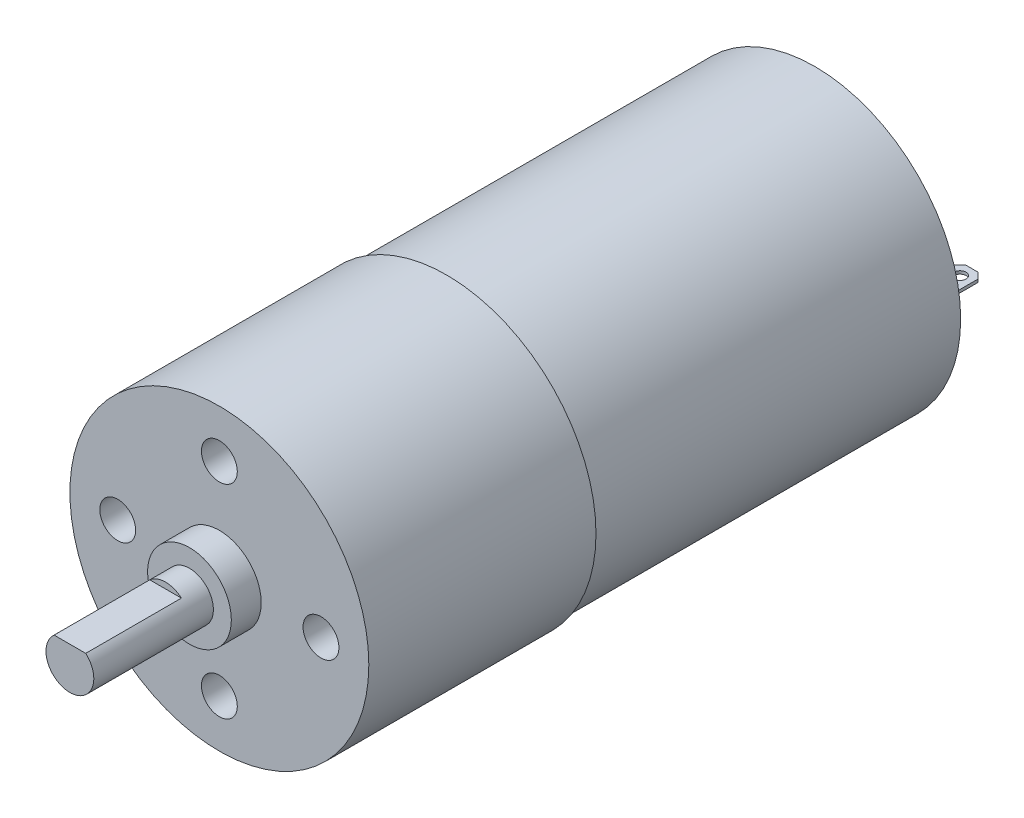
ISO-10303-21;
HEADER;
FILE_DESCRIPTION(('STEP AP214'),'2;1');
FILE_NAME('part.step','',(''),(''),'','','');
FILE_SCHEMA(('AUTOMOTIVE_DESIGN { 1 0 10303 214 1 1 1 1 }'));
ENDSEC;
DATA;
#1=APPLICATION_CONTEXT('core data for automotive mechanical design processes');
#2=APPLICATION_PROTOCOL_DEFINITION('international standard','automotive_design',2000,#1);
#3=PRODUCT_CONTEXT('',#1,'mechanical');
#4=PRODUCT('Part','Part','',(#3));
#5=PRODUCT_RELATED_PRODUCT_CATEGORY('part','',(#4));
#6=PRODUCT_DEFINITION_FORMATION('','',#4);
#7=PRODUCT_DEFINITION_CONTEXT('part definition',#1,'design');
#8=PRODUCT_DEFINITION('design','',#6,#7);
#9=PRODUCT_DEFINITION_SHAPE('','',#8);
#10=(LENGTH_UNIT() NAMED_UNIT(*) SI_UNIT(.MILLI.,.METRE.));
#11=(NAMED_UNIT(*) PLANE_ANGLE_UNIT() SI_UNIT($,.RADIAN.));
#12=(NAMED_UNIT(*) SI_UNIT($,.STERADIAN.) SOLID_ANGLE_UNIT());
#13=UNCERTAINTY_MEASURE_WITH_UNIT(LENGTH_MEASURE(1.E-05),#10,'distance_accuracy_value','');
#14=(GEOMETRIC_REPRESENTATION_CONTEXT(3) GLOBAL_UNCERTAINTY_ASSIGNED_CONTEXT((#13)) GLOBAL_UNIT_ASSIGNED_CONTEXT((#10,
#11,#12)) REPRESENTATION_CONTEXT('',''));
#15=CARTESIAN_POINT('',(0.,0.,0.));
#16=DIRECTION('',(0.,0.,1.));
#17=DIRECTION('',(1.,0.,0.));
#18=AXIS2_PLACEMENT_3D('',#15,#16,#17);
#19=CARTESIAN_POINT('',(0.,0.,-49.8));
#20=DIRECTION('',(0.,0.,-1.));
#21=DIRECTION('',(-1.,0.,0.));
#22=AXIS2_PLACEMENT_3D('',#19,#20,#21);
#23=PLANE('',#22);
#24=DIRECTION('',(1.,0.,0.));
#25=VECTOR('',#24,1.);
#26=CARTESIAN_POINT('',(-10.15,0.125,-49.8));
#27=LINE('',#26,#25);
#28=CARTESIAN_POINT('',(-10.15,0.125,-49.8));
#29=VERTEX_POINT('',#28);
#30=CARTESIAN_POINT('',(-8.15,0.125,-49.8));
#31=VERTEX_POINT('',#30);
#32=EDGE_CURVE('E142',#29,#31,#27,.T.);
#33=ORIENTED_EDGE('',*,*,#32,.F.);
#34=DIRECTION('',(0.,1.,0.));
#35=VECTOR('',#34,1.);
#36=CARTESIAN_POINT('',(-10.15,-0.125,-49.8));
#37=LINE('',#36,#35);
#38=CARTESIAN_POINT('',(-10.15,-0.125,-49.8));
#39=VERTEX_POINT('',#38);
#40=EDGE_CURVE('E149',#39,#29,#37,.T.);
#41=ORIENTED_EDGE('',*,*,#40,.F.);
#42=DIRECTION('',(-1.,0.,0.));
#43=VECTOR('',#42,1.);
#44=CARTESIAN_POINT('',(-10.15,-0.125,-49.8));
#45=LINE('',#44,#43);
#46=CARTESIAN_POINT('',(-8.15,-0.125,-49.8));
#47=VERTEX_POINT('',#46);
#48=EDGE_CURVE('E161',#47,#39,#45,.T.);
#49=ORIENTED_EDGE('',*,*,#48,.F.);
#50=DIRECTION('',(0.,-1.,0.));
#51=VECTOR('',#50,1.);
#52=CARTESIAN_POINT('',(-8.15,-0.125,-49.8));
#53=LINE('',#52,#51);
#54=EDGE_CURVE('E159',#31,#47,#53,.T.);
#55=ORIENTED_EDGE('',*,*,#54,.F.);
#56=EDGE_LOOP('',(#33,#41,#49,#55));
#57=FACE_BOUND('',#56,.T.);
#58=CARTESIAN_POINT('',(0.,0.,-49.8));
#59=DIRECTION('',(0.,0.,-1.));
#60=DIRECTION('',(-1.,0.,0.));
#61=AXIS2_PLACEMENT_3D('',#58,#59,#60);
#62=CIRCLE('',#61,12.2);
#63=CARTESIAN_POINT('',(12.2,0.,-49.8));
#64=VERTEX_POINT('',#63);
#65=EDGE_CURVE('E247',#64,#64,#62,.T.);
#66=ORIENTED_EDGE('',*,*,#65,.T.);
#67=EDGE_LOOP('',(#66));
#68=FACE_BOUND('',#67,.T.);
#69=DIRECTION('',(-1.,0.,0.));
#70=VECTOR('',#69,1.);
#71=CARTESIAN_POINT('',(10.15,-0.125,-49.8));
#72=LINE('',#71,#70);
#73=CARTESIAN_POINT('',(10.15,-0.125,-49.8));
#74=VERTEX_POINT('',#73);
#75=CARTESIAN_POINT('',(8.15,-0.125,-49.8));
#76=VERTEX_POINT('',#75);
#77=EDGE_CURVE('E188',#74,#76,#72,.T.);
#78=ORIENTED_EDGE('',*,*,#77,.F.);
#79=DIRECTION('',(0.,-1.,0.));
#80=VECTOR('',#79,1.);
#81=CARTESIAN_POINT('',(10.15,0.125,-49.8));
#82=LINE('',#81,#80);
#83=CARTESIAN_POINT('',(10.15,0.125,-49.8));
#84=VERTEX_POINT('',#83);
#85=EDGE_CURVE('E177',#84,#74,#82,.T.);
#86=ORIENTED_EDGE('',*,*,#85,.F.);
#87=DIRECTION('',(1.,0.,0.));
#88=VECTOR('',#87,1.);
#89=CARTESIAN_POINT('',(10.15,0.125,-49.8));
#90=LINE('',#89,#88);
#91=CARTESIAN_POINT('',(8.15,0.125,-49.8));
#92=VERTEX_POINT('',#91);
#93=EDGE_CURVE('E182',#92,#84,#90,.T.);
#94=ORIENTED_EDGE('',*,*,#93,.F.);
#95=DIRECTION('',(0.,1.,0.));
#96=VECTOR('',#95,1.);
#97=CARTESIAN_POINT('',(8.15,0.125,-49.8));
#98=LINE('',#97,#96);
#99=EDGE_CURVE('E191',#76,#92,#98,.T.);
#100=ORIENTED_EDGE('',*,*,#99,.F.);
#101=EDGE_LOOP('',(#78,#86,#94,#100));
#102=FACE_BOUND('',#101,.T.);
#103=CARTESIAN_POINT('',(0.,0.,-49.8));
#104=DIRECTION('',(0.,0.,-1.));
#105=DIRECTION('',(-1.,0.,0.));
#106=AXIS2_PLACEMENT_3D('',#103,#104,#105);
#107=CIRCLE('',#106,3.5);
#108=CARTESIAN_POINT('',(-3.5,0.,-49.8));
#109=VERTEX_POINT('',#108);
#110=EDGE_CURVE('E374',#109,#109,#107,.T.);
#111=ORIENTED_EDGE('',*,*,#110,.F.);
#112=EDGE_LOOP('',(#111));
#113=FACE_BOUND('',#112,.T.);
#114=ADVANCED_FACE('F35',(#57,#68,#102,#113),#23,.T.);
#115=CARTESIAN_POINT('',(0.,0.,2.5));
#116=DIRECTION('',(0.,0.,1.));
#117=DIRECTION('',(1.,0.,0.));
#118=AXIS2_PLACEMENT_3D('',#115,#116,#117);
#119=PLANE('',#118);
#120=CARTESIAN_POINT('',(0.,0.,2.5));
#121=DIRECTION('',(0.,0.,1.));
#122=DIRECTION('',(1.,0.,0.));
#123=AXIS2_PLACEMENT_3D('',#120,#121,#122);
#124=CIRCLE('',#123,3.5);
#125=CARTESIAN_POINT('',(3.5,0.,2.5));
#126=VERTEX_POINT('',#125);
#127=EDGE_CURVE('E220',#126,#126,#124,.T.);
#128=ORIENTED_EDGE('',*,*,#127,.T.);
#129=EDGE_LOOP('',(#128));
#130=FACE_BOUND('',#129,.T.);
#131=CARTESIAN_POINT('',(0.,0.,2.5));
#132=DIRECTION('',(0.,0.,1.));
#133=DIRECTION('',(1.,0.,0.));
#134=AXIS2_PLACEMENT_3D('',#131,#132,#133);
#135=CIRCLE('',#134,2.);
#136=CARTESIAN_POINT('',(2.,0.,2.5));
#137=VERTEX_POINT('',#136);
#138=EDGE_CURVE('E205',#137,#137,#135,.T.);
#139=ORIENTED_EDGE('',*,*,#138,.F.);
#140=EDGE_LOOP('',(#139));
#141=FACE_BOUND('',#140,.T.);
#142=ADVANCED_FACE('F310',(#130,#141),#119,.T.);
#143=CARTESIAN_POINT('',(0.,0.,0.));
#144=DIRECTION('',(0.,0.,1.));
#145=DIRECTION('',(1.,0.,0.));
#146=AXIS2_PLACEMENT_3D('',#143,#144,#145);
#147=PLANE('',#146);
#148=CARTESIAN_POINT('',(0.,0.,0.));
#149=DIRECTION('',(0.,0.,1.));
#150=DIRECTION('',(1.,0.,0.));
#151=AXIS2_PLACEMENT_3D('',#148,#149,#150);
#152=CIRCLE('',#151,12.5);
#153=CARTESIAN_POINT('',(12.5,0.,0.));
#154=VERTEX_POINT('',#153);
#155=EDGE_CURVE('E252',#154,#154,#152,.T.);
#156=ORIENTED_EDGE('',*,*,#155,.T.);
#157=EDGE_LOOP('',(#156));
#158=FACE_BOUND('',#157,.T.);
#159=CARTESIAN_POINT('',(-8.5,0.,0.));
#160=DIRECTION('',(0.,0.,1.));
#161=DIRECTION('',(1.,0.,0.));
#162=AXIS2_PLACEMENT_3D('',#159,#160,#161);
#163=CIRCLE('',#162,1.5);
#164=CARTESIAN_POINT('',(-7.,0.,0.));
#165=VERTEX_POINT('',#164);
#166=EDGE_CURVE('E241',#165,#165,#163,.T.);
#167=ORIENTED_EDGE('',*,*,#166,.F.);
#168=EDGE_LOOP('',(#167));
#169=FACE_BOUND('',#168,.T.);
#170=CARTESIAN_POINT('',(0.,-8.5,0.));
#171=DIRECTION('',(0.,0.,1.));
#172=DIRECTION('',(0.,1.,0.));
#173=AXIS2_PLACEMENT_3D('',#170,#171,#172);
#174=CIRCLE('',#173,1.5);
#175=CARTESIAN_POINT('',(0.,-7.,0.));
#176=VERTEX_POINT('',#175);
#177=EDGE_CURVE('E235',#176,#176,#174,.T.);
#178=ORIENTED_EDGE('',*,*,#177,.F.);
#179=EDGE_LOOP('',(#178));
#180=FACE_BOUND('',#179,.T.);
#181=CARTESIAN_POINT('',(8.5,0.,0.));
#182=DIRECTION('',(0.,0.,1.));
#183=DIRECTION('',(-1.,0.,0.));
#184=AXIS2_PLACEMENT_3D('',#181,#182,#183);
#185=CIRCLE('',#184,1.5);
#186=CARTESIAN_POINT('',(7.,0.,0.));
#187=VERTEX_POINT('',#186);
#188=EDGE_CURVE('E229',#187,#187,#185,.T.);
#189=ORIENTED_EDGE('',*,*,#188,.F.);
#190=EDGE_LOOP('',(#189));
#191=FACE_BOUND('',#190,.T.);
#192=CARTESIAN_POINT('',(0.,8.5,0.));
#193=DIRECTION('',(0.,0.,1.));
#194=DIRECTION('',(0.,-1.,0.));
#195=AXIS2_PLACEMENT_3D('',#192,#193,#194);
#196=CIRCLE('',#195,1.5);
#197=CARTESIAN_POINT('',(0.,7.,0.));
#198=VERTEX_POINT('',#197);
#199=EDGE_CURVE('E223',#198,#198,#196,.T.);
#200=ORIENTED_EDGE('',*,*,#199,.F.);
#201=EDGE_LOOP('',(#200));
#202=FACE_BOUND('',#201,.T.);
#203=CARTESIAN_POINT('',(0.,0.,0.));
#204=DIRECTION('',(0.,0.,1.));
#205=DIRECTION('',(1.,0.,0.));
#206=AXIS2_PLACEMENT_3D('',#203,#204,#205);
#207=CIRCLE('',#206,3.5);
#208=CARTESIAN_POINT('',(3.5,0.,0.));
#209=VERTEX_POINT('',#208);
#210=EDGE_CURVE('E219',#209,#209,#207,.T.);
#211=ORIENTED_EDGE('',*,*,#210,.F.);
#212=EDGE_LOOP('',(#211));
#213=FACE_BOUND('',#212,.T.);
#214=ADVANCED_FACE('F315',(#158,#169,#180,#191,#202,#213),#147,.T.);
#215=CARTESIAN_POINT('',(0.,0.,-19.));
#216=DIRECTION('',(0.,0.,1.));
#217=DIRECTION('',(1.,0.,0.));
#218=AXIS2_PLACEMENT_3D('',#215,#216,#217);
#219=PLANE('',#218);
#220=CARTESIAN_POINT('',(0.,0.,-19.));
#221=DIRECTION('',(0.,0.,1.));
#222=DIRECTION('',(1.,0.,0.));
#223=AXIS2_PLACEMENT_3D('',#220,#221,#222);
#224=CIRCLE('',#223,12.5);
#225=CARTESIAN_POINT('',(12.5,0.,-19.));
#226=VERTEX_POINT('',#225);
#227=EDGE_CURVE('E253',#226,#226,#224,.T.);
#228=ORIENTED_EDGE('',*,*,#227,.F.);
#229=EDGE_LOOP('',(#228));
#230=FACE_BOUND('',#229,.T.);
#231=CARTESIAN_POINT('',(0.,0.,-19.));
#232=DIRECTION('',(0.,0.,1.));
#233=DIRECTION('',(1.,0.,0.));
#234=AXIS2_PLACEMENT_3D('',#231,#232,#233);
#235=CIRCLE('',#234,12.2);
#236=CARTESIAN_POINT('',(12.2,0.,-19.));
#237=VERTEX_POINT('',#236);
#238=EDGE_CURVE('E256',#237,#237,#235,.F.);
#239=ORIENTED_EDGE('',*,*,#238,.F.);
#240=EDGE_LOOP('',(#239));
#241=FACE_BOUND('',#240,.T.);
#242=ADVANCED_FACE('F327',(#230,#241),#219,.F.);
#243=CARTESIAN_POINT('',(0.,0.,-19.));
#244=DIRECTION('',(0.,0.,1.));
#245=DIRECTION('',(1.,0.,0.));
#246=AXIS2_PLACEMENT_3D('',#243,#244,#245);
#247=CYLINDRICAL_SURFACE('',#246,12.5);
#248=ORIENTED_EDGE('',*,*,#227,.T.);
#249=EDGE_LOOP('',(#248));
#250=FACE_BOUND('',#249,.T.);
#251=ORIENTED_EDGE('',*,*,#155,.F.);
#252=EDGE_LOOP('',(#251));
#253=FACE_BOUND('',#252,.T.);
#254=ADVANCED_FACE('F325',(#250,#253),#247,.T.);
#255=CARTESIAN_POINT('',(0.,0.,-49.8));
#256=DIRECTION('',(0.,0.,1.));
#257=DIRECTION('',(1.,0.,0.));
#258=AXIS2_PLACEMENT_3D('',#255,#256,#257);
#259=CYLINDRICAL_SURFACE('',#258,12.2);
#260=CARTESIAN_POINT('',(12.2,0.,-49.8));
#261=CARTESIAN_POINT('',(12.2,0.,-49.4791666666667));
#262=CARTESIAN_POINT('',(12.2,0.,-49.1583333333333));
#263=CARTESIAN_POINT('',(12.2,0.,-48.5166666666667));
#264=CARTESIAN_POINT('',(12.2,0.,-48.1958333333333));
#265=CARTESIAN_POINT('',(12.2,0.,-47.5541666666667));
#266=CARTESIAN_POINT('',(12.2,0.,-47.2333333333333));
#267=CARTESIAN_POINT('',(12.2,0.,-46.5916666666667));
#268=CARTESIAN_POINT('',(12.2,0.,-46.2708333333333));
#269=CARTESIAN_POINT('',(12.2,0.,-45.6291666666667));
#270=CARTESIAN_POINT('',(12.2,0.,-45.3083333333333));
#271=CARTESIAN_POINT('',(12.2,0.,-44.6666666666667));
#272=CARTESIAN_POINT('',(12.2,0.,-44.3458333333333));
#273=CARTESIAN_POINT('',(12.2,0.,-43.7041666666667));
#274=CARTESIAN_POINT('',(12.2,0.,-43.3833333333333));
#275=CARTESIAN_POINT('',(12.2,0.,-42.7416666666667));
#276=CARTESIAN_POINT('',(12.2,0.,-42.4208333333333));
#277=CARTESIAN_POINT('',(12.2,0.,-41.7791666666667));
#278=CARTESIAN_POINT('',(12.2,0.,-41.4583333333333));
#279=CARTESIAN_POINT('',(12.2,0.,-40.8166666666667));
#280=CARTESIAN_POINT('',(12.2,0.,-40.4958333333333));
#281=CARTESIAN_POINT('',(12.2,0.,-39.8541666666667));
#282=CARTESIAN_POINT('',(12.2,0.,-39.5333333333333));
#283=CARTESIAN_POINT('',(12.2,0.,-38.8916666666667));
#284=CARTESIAN_POINT('',(12.2,0.,-38.5708333333333));
#285=CARTESIAN_POINT('',(12.2,0.,-37.9291666666667));
#286=CARTESIAN_POINT('',(12.2,0.,-37.6083333333333));
#287=CARTESIAN_POINT('',(12.2,0.,-36.9666666666667));
#288=CARTESIAN_POINT('',(12.2,0.,-36.6458333333333));
#289=CARTESIAN_POINT('',(12.2,0.,-36.0041666666667));
#290=CARTESIAN_POINT('',(12.2,0.,-35.6833333333333));
#291=CARTESIAN_POINT('',(12.2,0.,-35.0416666666667));
#292=CARTESIAN_POINT('',(12.2,0.,-34.7208333333333));
#293=CARTESIAN_POINT('',(12.2,0.,-34.0791666666667));
#294=CARTESIAN_POINT('',(12.2,0.,-33.7583333333333));
#295=CARTESIAN_POINT('',(12.2,0.,-33.1166666666667));
#296=CARTESIAN_POINT('',(12.2,0.,-32.7958333333333));
#297=CARTESIAN_POINT('',(12.2,0.,-32.1541666666667));
#298=CARTESIAN_POINT('',(12.2,0.,-31.8333333333333));
#299=CARTESIAN_POINT('',(12.2,0.,-31.1916666666667));
#300=CARTESIAN_POINT('',(12.2,0.,-30.8708333333333));
#301=CARTESIAN_POINT('',(12.2,0.,-30.2291666666667));
#302=CARTESIAN_POINT('',(12.2,0.,-29.9083333333333));
#303=CARTESIAN_POINT('',(12.2,0.,-29.2666666666667));
#304=CARTESIAN_POINT('',(12.2,0.,-28.9458333333333));
#305=CARTESIAN_POINT('',(12.2,0.,-28.3041666666667));
#306=CARTESIAN_POINT('',(12.2,0.,-27.9833333333333));
#307=CARTESIAN_POINT('',(12.2,0.,-27.3416666666667));
#308=CARTESIAN_POINT('',(12.2,0.,-27.0208333333333));
#309=CARTESIAN_POINT('',(12.2,0.,-26.3791666666667));
#310=CARTESIAN_POINT('',(12.2,0.,-26.0583333333333));
#311=CARTESIAN_POINT('',(12.2,0.,-25.4166666666667));
#312=CARTESIAN_POINT('',(12.2,0.,-25.0958333333333));
#313=CARTESIAN_POINT('',(12.2,0.,-24.4541666666667));
#314=CARTESIAN_POINT('',(12.2,0.,-24.1333333333333));
#315=CARTESIAN_POINT('',(12.2,0.,-23.4916666666667));
#316=CARTESIAN_POINT('',(12.2,0.,-23.1708333333333));
#317=CARTESIAN_POINT('',(12.2,0.,-22.5291666666667));
#318=CARTESIAN_POINT('',(12.2,0.,-22.2083333333333));
#319=CARTESIAN_POINT('',(12.2,0.,-21.5666666666667));
#320=CARTESIAN_POINT('',(12.2,0.,-21.2458333333333));
#321=CARTESIAN_POINT('',(12.2,0.,-20.6041666666667));
#322=CARTESIAN_POINT('',(12.2,0.,-20.2833333333333));
#323=CARTESIAN_POINT('',(12.2,0.,-19.6416666666667));
#324=CARTESIAN_POINT('',(12.2,0.,-19.3208333333333));
#325=CARTESIAN_POINT('',(12.2,0.,-19.));
#326=B_SPLINE_CURVE_WITH_KNOTS('',3,(#260,#261,#262,#263,#264,#265,#266,#267,#268,#269,#270,
#271,#272,#273,#274,#275,#276,#277,#278,#279,#280,#281,#282,#283,#284,#285,#286,#287,#288,#289,
#290,#291,#292,#293,#294,#295,#296,#297,#298,#299,#300,#301,#302,#303,#304,#305,#306,#307,#308,
#309,#310,#311,#312,#313,#314,#315,#316,#317,#318,#319,#320,#321,#322,#323,#324,#325),
.UNSPECIFIED.,.F.,.F.,(4,2,2,2,2,2,2,2,2,2,2,2,2,2,2,2,2,2,2,2,2,2,2,2,2,2,2,2,2,2,2,2,4),(0.,
0.962499999999998,1.925,2.88749999999999,3.85,4.8125,5.775,6.73749999999999,7.69999999999999,
8.6625,9.62499999999999,10.5875,11.55,12.5125,13.475,14.4375,15.4,16.3625,17.325,18.2875,19.25,
20.2125,21.175,22.1375,23.1,24.0625,25.025,25.9875,26.95,27.9125,28.875,29.8375,30.8),.UNSPECIFIED.);
#327=EDGE_CURVE('BSEAM322',#64,#237,#326,.T.);
#328=ORIENTED_EDGE('',*,*,#65,.F.);
#329=ORIENTED_EDGE('',*,*,#238,.T.);
#330=ORIENTED_EDGE('',*,*,#327,.T.);
#331=ORIENTED_EDGE('',*,*,#327,.F.);
#332=EDGE_LOOP('',(#328,#330,#329,#331));
#333=FACE_BOUND('',#332,.T.);
#334=ADVANCED_FACE('F322',(#333),#259,.T.);
#335=CARTESIAN_POINT('',(-8.5,0.,-10.));
#336=DIRECTION('',(0.,0.,1.));
#337=DIRECTION('',(1.,0.,0.));
#338=AXIS2_PLACEMENT_3D('',#335,#336,#337);
#339=CYLINDRICAL_SURFACE('',#338,1.5);
#340=CARTESIAN_POINT('',(-8.5,0.,-10.));
#341=DIRECTION('',(0.,0.,1.));
#342=DIRECTION('',(1.,0.,0.));
#343=AXIS2_PLACEMENT_3D('',#340,#341,#342);
#344=CIRCLE('',#343,1.5);
#345=CARTESIAN_POINT('',(-7.,0.,-10.));
#346=VERTEX_POINT('',#345);
#347=EDGE_CURVE('E244',#346,#346,#344,.T.);
#348=ORIENTED_EDGE('',*,*,#347,.F.);
#349=EDGE_LOOP('',(#348));
#350=FACE_BOUND('',#349,.T.);
#351=ORIENTED_EDGE('',*,*,#166,.T.);
#352=EDGE_LOOP('',(#351));
#353=FACE_BOUND('',#352,.T.);
#354=ADVANCED_FACE('F320',(#350,#353),#339,.F.);
#355=CARTESIAN_POINT('',(-8.5,0.,-10.));
#356=DIRECTION('',(0.,0.,1.));
#357=DIRECTION('',(1.,0.,0.));
#358=AXIS2_PLACEMENT_3D('',#355,#356,#357);
#359=PLANE('',#358);
#360=ORIENTED_EDGE('',*,*,#347,.T.);
#361=EDGE_LOOP('',(#360));
#362=FACE_BOUND('',#361,.T.);
#363=ADVANCED_FACE('F464',(#362),#359,.T.);
#364=CARTESIAN_POINT('',(0.,-8.5,-10.));
#365=DIRECTION('',(0.,0.,1.));
#366=DIRECTION('',(1.,0.,0.));
#367=AXIS2_PLACEMENT_3D('',#364,#365,#366);
#368=CYLINDRICAL_SURFACE('',#367,1.5);
#369=CARTESIAN_POINT('',(0.,-8.5,-10.));
#370=DIRECTION('',(0.,0.,1.));
#371=DIRECTION('',(0.,1.,0.));
#372=AXIS2_PLACEMENT_3D('',#369,#370,#371);
#373=CIRCLE('',#372,1.5);
#374=CARTESIAN_POINT('',(0.,-7.,-10.));
#375=VERTEX_POINT('',#374);
#376=EDGE_CURVE('E238',#375,#375,#373,.T.);
#377=ORIENTED_EDGE('',*,*,#376,.F.);
#378=EDGE_LOOP('',(#377));
#379=FACE_BOUND('',#378,.T.);
#380=ORIENTED_EDGE('',*,*,#177,.T.);
#381=EDGE_LOOP('',(#380));
#382=FACE_BOUND('',#381,.T.);
#383=ADVANCED_FACE('F461',(#379,#382),#368,.F.);
#384=CARTESIAN_POINT('',(0.,-8.5,-10.));
#385=DIRECTION('',(0.,0.,1.));
#386=DIRECTION('',(0.,1.,0.));
#387=AXIS2_PLACEMENT_3D('',#384,#385,#386);
#388=PLANE('',#387);
#389=ORIENTED_EDGE('',*,*,#376,.T.);
#390=EDGE_LOOP('',(#389));
#391=FACE_BOUND('',#390,.T.);
#392=ADVANCED_FACE('F457',(#391),#388,.T.);
#393=CARTESIAN_POINT('',(8.5,0.,-10.));
#394=DIRECTION('',(0.,0.,1.));
#395=DIRECTION('',(1.,0.,0.));
#396=AXIS2_PLACEMENT_3D('',#393,#394,#395);
#397=CYLINDRICAL_SURFACE('',#396,1.5);
#398=CARTESIAN_POINT('',(8.5,0.,-10.));
#399=DIRECTION('',(0.,0.,1.));
#400=DIRECTION('',(-1.,0.,0.));
#401=AXIS2_PLACEMENT_3D('',#398,#399,#400);
#402=CIRCLE('',#401,1.5);
#403=CARTESIAN_POINT('',(7.,0.,-10.));
#404=VERTEX_POINT('',#403);
#405=EDGE_CURVE('E232',#404,#404,#402,.T.);
#406=ORIENTED_EDGE('',*,*,#405,.F.);
#407=EDGE_LOOP('',(#406));
#408=FACE_BOUND('',#407,.T.);
#409=ORIENTED_EDGE('',*,*,#188,.T.);
#410=EDGE_LOOP('',(#409));
#411=FACE_BOUND('',#410,.T.);
#412=ADVANCED_FACE('F453',(#408,#411),#397,.F.);
#413=CARTESIAN_POINT('',(8.5,0.,-10.));
#414=DIRECTION('',(0.,0.,1.));
#415=DIRECTION('',(-1.,0.,0.));
#416=AXIS2_PLACEMENT_3D('',#413,#414,#415);
#417=PLANE('',#416);
#418=ORIENTED_EDGE('',*,*,#405,.T.);
#419=EDGE_LOOP('',(#418));
#420=FACE_BOUND('',#419,.T.);
#421=ADVANCED_FACE('F449',(#420),#417,.T.);
#422=CARTESIAN_POINT('',(0.,8.5,-10.));
#423=DIRECTION('',(0.,0.,1.));
#424=DIRECTION('',(1.,0.,0.));
#425=AXIS2_PLACEMENT_3D('',#422,#423,#424);
#426=CYLINDRICAL_SURFACE('',#425,1.5);
#427=CARTESIAN_POINT('',(0.,8.5,-10.));
#428=DIRECTION('',(0.,0.,1.));
#429=DIRECTION('',(0.,-1.,0.));
#430=AXIS2_PLACEMENT_3D('',#427,#428,#429);
#431=CIRCLE('',#430,1.5);
#432=CARTESIAN_POINT('',(0.,7.,-10.));
#433=VERTEX_POINT('',#432);
#434=EDGE_CURVE('E226',#433,#433,#431,.T.);
#435=ORIENTED_EDGE('',*,*,#434,.F.);
#436=EDGE_LOOP('',(#435));
#437=FACE_BOUND('',#436,.T.);
#438=ORIENTED_EDGE('',*,*,#199,.T.);
#439=EDGE_LOOP('',(#438));
#440=FACE_BOUND('',#439,.T.);
#441=ADVANCED_FACE('F445',(#437,#440),#426,.F.);
#442=CARTESIAN_POINT('',(0.,8.5,-10.));
#443=DIRECTION('',(0.,0.,1.));
#444=DIRECTION('',(0.,-1.,0.));
#445=AXIS2_PLACEMENT_3D('',#442,#443,#444);
#446=PLANE('',#445);
#447=ORIENTED_EDGE('',*,*,#434,.T.);
#448=EDGE_LOOP('',(#447));
#449=FACE_BOUND('',#448,.T.);
#450=ADVANCED_FACE('F441',(#449),#446,.T.);
#451=CARTESIAN_POINT('',(0.,0.,2.5));
#452=DIRECTION('',(0.,0.,-1.));
#453=DIRECTION('',(-1.,0.,0.));
#454=AXIS2_PLACEMENT_3D('',#451,#452,#453);
#455=CYLINDRICAL_SURFACE('',#454,3.5);
#456=ORIENTED_EDGE('',*,*,#127,.F.);
#457=EDGE_LOOP('',(#456));
#458=FACE_BOUND('',#457,.T.);
#459=ORIENTED_EDGE('',*,*,#210,.T.);
#460=EDGE_LOOP('',(#459));
#461=FACE_BOUND('',#460,.T.);
#462=ADVANCED_FACE('F436',(#458,#461),#455,.T.);
#463=CARTESIAN_POINT('',(0.,0.,12.5));
#464=DIRECTION('',(0.,0.,-1.));
#465=DIRECTION('',(-1.,0.,0.));
#466=AXIS2_PLACEMENT_3D('',#463,#464,#465);
#467=CYLINDRICAL_SURFACE('',#466,2.);
#468=DIRECTION('',(0.,0.,-1.));
#469=VECTOR('',#468,1.);
#470=CARTESIAN_POINT('',(-1.3228756555323,1.5,12.5));
#471=LINE('',#470,#469);
#472=CARTESIAN_POINT('',(-1.3228756555323,1.5,12.5));
#473=VERTEX_POINT('',#472);
#474=CARTESIAN_POINT('',(-1.3228756555323,1.5,4.5));
#475=VERTEX_POINT('',#474);
#476=EDGE_CURVE('E211',#473,#475,#471,.T.);
#477=ORIENTED_EDGE('',*,*,#476,.T.);
#478=CARTESIAN_POINT('',(0.,0.,4.5));
#479=DIRECTION('',(0.,0.,1.));
#480=DIRECTION('',(1.,0.,0.));
#481=AXIS2_PLACEMENT_3D('',#478,#479,#480);
#482=CIRCLE('',#481,2.);
#483=CARTESIAN_POINT('',(1.3228756555323,1.5,4.5));
#484=VERTEX_POINT('',#483);
#485=EDGE_CURVE('E203',#484,#475,#482,.T.);
#486=ORIENTED_EDGE('',*,*,#485,.F.);
#487=DIRECTION('',(0.,0.,-1.));
#488=VECTOR('',#487,1.);
#489=CARTESIAN_POINT('',(1.3228756555323,1.5,12.5));
#490=LINE('',#489,#488);
#491=CARTESIAN_POINT('',(1.3228756555323,1.5,12.5));
#492=VERTEX_POINT('',#491);
#493=EDGE_CURVE('E216',#492,#484,#490,.T.);
#494=ORIENTED_EDGE('',*,*,#493,.F.);
#495=CARTESIAN_POINT('',(0.,0.,12.5));
#496=DIRECTION('',(0.,0.,1.));
#497=DIRECTION('',(1.,0.,0.));
#498=AXIS2_PLACEMENT_3D('',#495,#496,#497);
#499=CIRCLE('',#498,2.);
#500=EDGE_CURVE('E206',#473,#492,#499,.T.);
#501=ORIENTED_EDGE('',*,*,#500,.F.);
#502=EDGE_LOOP('',(#477,#486,#494,#501));
#503=FACE_BOUND('',#502,.T.);
#504=ORIENTED_EDGE('',*,*,#138,.T.);
#505=EDGE_LOOP('',(#504));
#506=FACE_BOUND('',#505,.T.);
#507=ADVANCED_FACE('F433',(#503,#506),#467,.T.);
#508=CARTESIAN_POINT('',(-1.3228756555323,1.5,12.5));
#509=DIRECTION('',(0.,-1.,0.));
#510=DIRECTION('',(0.,0.,-1.));
#511=AXIS2_PLACEMENT_3D('',#508,#509,#510);
#512=PLANE('',#511);
#513=ORIENTED_EDGE('',*,*,#493,.T.);
#514=DIRECTION('',(-1.,0.,0.));
#515=VECTOR('',#514,1.);
#516=CARTESIAN_POINT('',(-1.3228756555323,1.5,4.5));
#517=LINE('',#516,#515);
#518=EDGE_CURVE('E261',#484,#475,#517,.T.);
#519=ORIENTED_EDGE('',*,*,#518,.T.);
#520=ORIENTED_EDGE('',*,*,#476,.F.);
#521=DIRECTION('',(-1.,0.,0.));
#522=VECTOR('',#521,1.);
#523=CARTESIAN_POINT('',(-1.3228756555323,1.5,12.5));
#524=LINE('',#523,#522);
#525=EDGE_CURVE('E209',#492,#473,#524,.T.);
#526=ORIENTED_EDGE('',*,*,#525,.F.);
#527=EDGE_LOOP('',(#513,#519,#520,#526));
#528=FACE_BOUND('',#527,.T.);
#529=ADVANCED_FACE('F429',(#528),#512,.F.);
#530=CARTESIAN_POINT('',(0.,0.,12.5));
#531=DIRECTION('',(0.,0.,1.));
#532=DIRECTION('',(1.,0.,0.));
#533=AXIS2_PLACEMENT_3D('',#530,#531,#532);
#534=PLANE('',#533);
#535=ORIENTED_EDGE('',*,*,#500,.T.);
#536=ORIENTED_EDGE('',*,*,#525,.T.);
#537=EDGE_LOOP('',(#535,#536));
#538=FACE_BOUND('',#537,.T.);
#539=ADVANCED_FACE('F425',(#538),#534,.T.);
#540=CARTESIAN_POINT('',(0.,0.,4.5));
#541=DIRECTION('',(0.,0.,1.));
#542=DIRECTION('',(1.,0.,0.));
#543=AXIS2_PLACEMENT_3D('',#540,#541,#542);
#544=PLANE('',#543);
#545=ORIENTED_EDGE('',*,*,#518,.F.);
#546=ORIENTED_EDGE('',*,*,#485,.T.);
#547=EDGE_LOOP('',(#545,#546));
#548=FACE_BOUND('',#547,.T.);
#549=ADVANCED_FACE('F421',(#548),#544,.T.);
#550=CARTESIAN_POINT('',(10.15,0.125,-53.8));
#551=DIRECTION('',(-1.,0.,0.));
#552=DIRECTION('',(0.,0.,1.));
#553=AXIS2_PLACEMENT_3D('',#550,#551,#552);
#554=PLANE('',#553);
#555=DIRECTION('',(0.,0.,1.));
#556=VECTOR('',#555,1.);
#557=CARTESIAN_POINT('',(10.15,-0.125,-53.8));
#558=LINE('',#557,#556);
#559=CARTESIAN_POINT('',(10.15,-0.125,-53.3));
#560=VERTEX_POINT('',#559);
#561=EDGE_CURVE('E201',#560,#74,#558,.T.);
#562=ORIENTED_EDGE('',*,*,#561,.F.);
#563=DIRECTION('',(0.,1.,0.));
#564=VECTOR('',#563,1.);
#565=CARTESIAN_POINT('',(10.15,0.125,-53.3));
#566=LINE('',#565,#564);
#567=CARTESIAN_POINT('',(10.15,0.125,-53.3));
#568=VERTEX_POINT('',#567);
#569=EDGE_CURVE('E274',#560,#568,#566,.T.);
#570=ORIENTED_EDGE('',*,*,#569,.T.);
#571=DIRECTION('',(0.,0.,1.));
#572=VECTOR('',#571,1.);
#573=CARTESIAN_POINT('',(10.15,0.125,-53.8));
#574=LINE('',#573,#572);
#575=EDGE_CURVE('E185',#568,#84,#574,.T.);
#576=ORIENTED_EDGE('',*,*,#575,.T.);
#577=ORIENTED_EDGE('',*,*,#85,.T.);
#578=EDGE_LOOP('',(#562,#570,#576,#577));
#579=FACE_BOUND('',#578,.T.);
#580=ADVANCED_FACE('F417',(#579),#554,.F.);
#581=CARTESIAN_POINT('',(10.15,-0.125,-53.8));
#582=DIRECTION('',(0.,1.,0.));
#583=DIRECTION('',(0.,0.,1.));
#584=AXIS2_PLACEMENT_3D('',#581,#582,#583);
#585=PLANE('',#584);
#586=CARTESIAN_POINT('',(9.15,-0.125,-52.8));
#587=DIRECTION('',(0.,1.,0.));
#588=DIRECTION('',(0.,0.,1.));
#589=AXIS2_PLACEMENT_3D('',#586,#587,#588);
#590=CIRCLE('',#589,0.500000000000001);
#591=CARTESIAN_POINT('',(9.15,-0.125,-52.3));
#592=VERTEX_POINT('',#591);
#593=EDGE_CURVE('E174',#592,#592,#590,.F.);
#594=ORIENTED_EDGE('',*,*,#593,.F.);
#595=EDGE_LOOP('',(#594));
#596=FACE_BOUND('',#595,.T.);
#597=DIRECTION('',(-1.,0.,0.));
#598=VECTOR('',#597,1.);
#599=CARTESIAN_POINT('',(10.15,-0.125,-53.8));
#600=LINE('',#599,#598);
#601=CARTESIAN_POINT('',(9.65,-0.125,-53.8));
#602=VERTEX_POINT('',#601);
#603=CARTESIAN_POINT('',(8.65,-0.125,-53.8));
#604=VERTEX_POINT('',#603);
#605=EDGE_CURVE('E178',#602,#604,#600,.T.);
#606=ORIENTED_EDGE('',*,*,#605,.F.);
#607=DIRECTION('',(0.707106781186548,0.,0.707106781186548));
#608=VECTOR('',#607,1.);
#609=CARTESIAN_POINT('',(9.65,-0.125,-53.8));
#610=LINE('',#609,#608);
#611=EDGE_CURVE('E272',#602,#560,#610,.T.);
#612=ORIENTED_EDGE('',*,*,#611,.T.);
#613=ORIENTED_EDGE('',*,*,#561,.T.);
#614=ORIENTED_EDGE('',*,*,#77,.T.);
#615=DIRECTION('',(0.,0.,1.));
#616=VECTOR('',#615,1.);
#617=CARTESIAN_POINT('',(8.15,-0.125,-53.8));
#618=LINE('',#617,#616);
#619=CARTESIAN_POINT('',(8.15,-0.125,-53.3));
#620=VERTEX_POINT('',#619);
#621=EDGE_CURVE('E199',#620,#76,#618,.T.);
#622=ORIENTED_EDGE('',*,*,#621,.F.);
#623=DIRECTION('',(0.707106781186548,0.,-0.707106781186548));
#624=VECTOR('',#623,1.);
#625=CARTESIAN_POINT('',(8.65,-0.125,-53.8));
#626=LINE('',#625,#624);
#627=EDGE_CURVE('E270',#620,#604,#626,.T.);
#628=ORIENTED_EDGE('',*,*,#627,.T.);
#629=EDGE_LOOP('',(#606,#612,#613,#614,#622,#628));
#630=FACE_BOUND('',#629,.T.);
#631=ADVANCED_FACE('F413',(#596,#630),#585,.F.);
#632=CARTESIAN_POINT('',(8.15,0.125,-53.8));
#633=DIRECTION('',(1.,0.,0.));
#634=DIRECTION('',(0.,0.,-1.));
#635=AXIS2_PLACEMENT_3D('',#632,#633,#634);
#636=PLANE('',#635);
#637=DIRECTION('',(0.,0.,1.));
#638=VECTOR('',#637,1.);
#639=CARTESIAN_POINT('',(8.15,0.125,-53.8));
#640=LINE('',#639,#638);
#641=CARTESIAN_POINT('',(8.15,0.125,-53.3));
#642=VERTEX_POINT('',#641);
#643=EDGE_CURVE('E197',#642,#92,#640,.T.);
#644=ORIENTED_EDGE('',*,*,#643,.F.);
#645=DIRECTION('',(0.,-1.,0.));
#646=VECTOR('',#645,1.);
#647=CARTESIAN_POINT('',(8.15,-0.125,-53.3));
#648=LINE('',#647,#646);
#649=EDGE_CURVE('E280',#642,#620,#648,.T.);
#650=ORIENTED_EDGE('',*,*,#649,.T.);
#651=ORIENTED_EDGE('',*,*,#621,.T.);
#652=ORIENTED_EDGE('',*,*,#99,.T.);
#653=EDGE_LOOP('',(#644,#650,#651,#652));
#654=FACE_BOUND('',#653,.T.);
#655=ADVANCED_FACE('F409',(#654),#636,.F.);
#656=CARTESIAN_POINT('',(10.15,0.125,-53.8));
#657=DIRECTION('',(0.,-1.,0.));
#658=DIRECTION('',(0.,0.,-1.));
#659=AXIS2_PLACEMENT_3D('',#656,#657,#658);
#660=PLANE('',#659);
#661=CARTESIAN_POINT('',(9.15,0.125,-52.8));
#662=DIRECTION('',(0.,1.,0.));
#663=DIRECTION('',(0.,0.,1.));
#664=AXIS2_PLACEMENT_3D('',#661,#662,#663);
#665=CIRCLE('',#664,0.500000000000001);
#666=CARTESIAN_POINT('',(9.15,0.125,-52.3));
#667=VERTEX_POINT('',#666);
#668=EDGE_CURVE('E145',#667,#667,#665,.T.);
#669=ORIENTED_EDGE('',*,*,#668,.F.);
#670=EDGE_LOOP('',(#669));
#671=FACE_BOUND('',#670,.T.);
#672=ORIENTED_EDGE('',*,*,#575,.F.);
#673=DIRECTION('',(-0.707106781186548,0.,-0.707106781186548));
#674=VECTOR('',#673,1.);
#675=CARTESIAN_POINT('',(9.65,0.125,-53.8));
#676=LINE('',#675,#674);
#677=CARTESIAN_POINT('',(9.65,0.125,-53.8));
#678=VERTEX_POINT('',#677);
#679=EDGE_CURVE('E278',#568,#678,#676,.T.);
#680=ORIENTED_EDGE('',*,*,#679,.T.);
#681=DIRECTION('',(1.,0.,0.));
#682=VECTOR('',#681,1.);
#683=CARTESIAN_POINT('',(10.15,0.125,-53.8));
#684=LINE('',#683,#682);
#685=CARTESIAN_POINT('',(8.65,0.125,-53.8));
#686=VERTEX_POINT('',#685);
#687=EDGE_CURVE('E181',#686,#678,#684,.T.);
#688=ORIENTED_EDGE('',*,*,#687,.F.);
#689=DIRECTION('',(-0.707106781186548,0.,0.707106781186548));
#690=VECTOR('',#689,1.);
#691=CARTESIAN_POINT('',(8.65,0.125,-53.8));
#692=LINE('',#691,#690);
#693=EDGE_CURVE('E276',#686,#642,#692,.T.);
#694=ORIENTED_EDGE('',*,*,#693,.T.);
#695=ORIENTED_EDGE('',*,*,#643,.T.);
#696=ORIENTED_EDGE('',*,*,#93,.T.);
#697=EDGE_LOOP('',(#672,#680,#688,#694,#695,#696));
#698=FACE_BOUND('',#697,.T.);
#699=ADVANCED_FACE('F405',(#671,#698),#660,.F.);
#700=CARTESIAN_POINT('',(0.,0.,-53.8));
#701=DIRECTION('',(0.,0.,-1.));
#702=DIRECTION('',(-1.,0.,0.));
#703=AXIS2_PLACEMENT_3D('',#700,#701,#702);
#704=PLANE('',#703);
#705=ORIENTED_EDGE('',*,*,#687,.T.);
#706=DIRECTION('',(0.,-1.,0.));
#707=VECTOR('',#706,1.);
#708=CARTESIAN_POINT('',(9.65,-0.125,-53.8));
#709=LINE('',#708,#707);
#710=EDGE_CURVE('E267',#678,#602,#709,.T.);
#711=ORIENTED_EDGE('',*,*,#710,.T.);
#712=ORIENTED_EDGE('',*,*,#605,.T.);
#713=DIRECTION('',(0.,1.,0.));
#714=VECTOR('',#713,1.);
#715=CARTESIAN_POINT('',(8.65,0.125,-53.8));
#716=LINE('',#715,#714);
#717=EDGE_CURVE('E264',#604,#686,#716,.T.);
#718=ORIENTED_EDGE('',*,*,#717,.T.);
#719=EDGE_LOOP('',(#705,#711,#712,#718));
#720=FACE_BOUND('',#719,.T.);
#721=ADVANCED_FACE('F341',(#720),#704,.T.);
#722=CARTESIAN_POINT('',(9.65,0.,-53.8));
#723=DIRECTION('',(0.707106781186547,0.,-0.707106781186547));
#724=DIRECTION('',(0.,1.,0.));
#725=AXIS2_PLACEMENT_3D('',#722,#723,#724);
#726=PLANE('',#725);
#727=ORIENTED_EDGE('',*,*,#679,.F.);
#728=ORIENTED_EDGE('',*,*,#569,.F.);
#729=ORIENTED_EDGE('',*,*,#611,.F.);
#730=ORIENTED_EDGE('',*,*,#710,.F.);
#731=EDGE_LOOP('',(#727,#728,#729,#730));
#732=FACE_BOUND('',#731,.T.);
#733=ADVANCED_FACE('F337',(#732),#726,.T.);
#734=CARTESIAN_POINT('',(8.65,0.,-53.8));
#735=DIRECTION('',(-0.707106781186547,0.,-0.707106781186547));
#736=DIRECTION('',(0.,-1.,0.));
#737=AXIS2_PLACEMENT_3D('',#734,#735,#736);
#738=PLANE('',#737);
#739=ORIENTED_EDGE('',*,*,#627,.F.);
#740=ORIENTED_EDGE('',*,*,#649,.F.);
#741=ORIENTED_EDGE('',*,*,#693,.F.);
#742=ORIENTED_EDGE('',*,*,#717,.F.);
#743=EDGE_LOOP('',(#739,#740,#741,#742));
#744=FACE_BOUND('',#743,.T.);
#745=ADVANCED_FACE('F340',(#744),#738,.T.);
#746=CARTESIAN_POINT('',(9.15,-12.501,-52.8));
#747=DIRECTION('',(0.,1.,0.));
#748=DIRECTION('',(0.,0.,1.));
#749=AXIS2_PLACEMENT_3D('',#746,#747,#748);
#750=CYLINDRICAL_SURFACE('',#749,0.500000000000001);
#751=ORIENTED_EDGE('',*,*,#668,.T.);
#752=EDGE_LOOP('',(#751));
#753=FACE_BOUND('',#752,.T.);
#754=ORIENTED_EDGE('',*,*,#593,.T.);
#755=EDGE_LOOP('',(#754));
#756=FACE_BOUND('',#755,.T.);
#757=ADVANCED_FACE('F345',(#753,#756),#750,.F.);
#758=CARTESIAN_POINT('',(-10.15,-0.125,-53.8));
#759=DIRECTION('',(1.,0.,0.));
#760=DIRECTION('',(0.,0.,-1.));
#761=AXIS2_PLACEMENT_3D('',#758,#759,#760);
#762=PLANE('',#761);
#763=DIRECTION('',(0.,0.,1.));
#764=VECTOR('',#763,1.);
#765=CARTESIAN_POINT('',(-10.15,0.125,-53.8));
#766=LINE('',#765,#764);
#767=CARTESIAN_POINT('',(-10.15,0.125,-53.3));
#768=VERTEX_POINT('',#767);
#769=EDGE_CURVE('E136',#768,#29,#766,.T.);
#770=ORIENTED_EDGE('',*,*,#769,.F.);
#771=DIRECTION('',(0.,-1.,0.));
#772=VECTOR('',#771,1.);
#773=CARTESIAN_POINT('',(-10.15,-0.125,-53.3));
#774=LINE('',#773,#772);
#775=CARTESIAN_POINT('',(-10.15,-0.125,-53.3));
#776=VERTEX_POINT('',#775);
#777=EDGE_CURVE('E58',#768,#776,#774,.T.);
#778=ORIENTED_EDGE('',*,*,#777,.T.);
#779=DIRECTION('',(0.,0.,1.));
#780=VECTOR('',#779,1.);
#781=CARTESIAN_POINT('',(-10.15,-0.125,-53.8));
#782=LINE('',#781,#780);
#783=EDGE_CURVE('E151',#776,#39,#782,.T.);
#784=ORIENTED_EDGE('',*,*,#783,.T.);
#785=ORIENTED_EDGE('',*,*,#40,.T.);
#786=EDGE_LOOP('',(#770,#778,#784,#785));
#787=FACE_BOUND('',#786,.T.);
#788=ADVANCED_FACE('F150',(#787),#762,.F.);
#789=CARTESIAN_POINT('',(-10.15,0.125,-53.8));
#790=DIRECTION('',(0.,-1.,0.));
#791=DIRECTION('',(0.,0.,-1.));
#792=AXIS2_PLACEMENT_3D('',#789,#790,#791);
#793=PLANE('',#792);
#794=CARTESIAN_POINT('',(-9.15,0.125,-52.8));
#795=DIRECTION('',(0.,-1.,0.));
#796=DIRECTION('',(0.,0.,-1.));
#797=AXIS2_PLACEMENT_3D('',#794,#795,#796);
#798=CIRCLE('',#797,0.500000000000001);
#799=CARTESIAN_POINT('',(-9.15,0.125,-53.3));
#800=VERTEX_POINT('',#799);
#801=EDGE_CURVE('E155',#800,#800,#798,.F.);
#802=ORIENTED_EDGE('',*,*,#801,.F.);
#803=EDGE_LOOP('',(#802));
#804=FACE_BOUND('',#803,.T.);
#805=DIRECTION('',(1.,0.,0.));
#806=VECTOR('',#805,1.);
#807=CARTESIAN_POINT('',(-10.15,0.125,-53.8));
#808=LINE('',#807,#806);
#809=CARTESIAN_POINT('',(-9.65,0.125,-53.8));
#810=VERTEX_POINT('',#809);
#811=CARTESIAN_POINT('',(-8.65,0.125,-53.8));
#812=VERTEX_POINT('',#811);
#813=EDGE_CURVE('E166',#810,#812,#808,.T.);
#814=ORIENTED_EDGE('',*,*,#813,.F.);
#815=DIRECTION('',(-0.707106781186548,0.,0.707106781186548));
#816=VECTOR('',#815,1.);
#817=CARTESIAN_POINT('',(-9.65,0.125,-53.8));
#818=LINE('',#817,#816);
#819=EDGE_CURVE('E144',#810,#768,#818,.T.);
#820=ORIENTED_EDGE('',*,*,#819,.T.);
#821=ORIENTED_EDGE('',*,*,#769,.T.);
#822=ORIENTED_EDGE('',*,*,#32,.T.);
#823=DIRECTION('',(0.,0.,1.));
#824=VECTOR('',#823,1.);
#825=CARTESIAN_POINT('',(-8.15,0.125,-53.8));
#826=LINE('',#825,#824);
#827=CARTESIAN_POINT('',(-8.15,0.125,-53.3));
#828=VERTEX_POINT('',#827);
#829=EDGE_CURVE('E146',#828,#31,#826,.T.);
#830=ORIENTED_EDGE('',*,*,#829,.F.);
#831=DIRECTION('',(-0.707106781186548,0.,-0.707106781186548));
#832=VECTOR('',#831,1.);
#833=CARTESIAN_POINT('',(-8.65,0.125,-53.8));
#834=LINE('',#833,#832);
#835=EDGE_CURVE('E288',#828,#812,#834,.T.);
#836=ORIENTED_EDGE('',*,*,#835,.T.);
#837=EDGE_LOOP('',(#814,#820,#821,#822,#830,#836));
#838=FACE_BOUND('',#837,.T.);
#839=ADVANCED_FACE('F139',(#804,#838),#793,.F.);
#840=CARTESIAN_POINT('',(-8.15,-0.125,-53.8));
#841=DIRECTION('',(-1.,0.,0.));
#842=DIRECTION('',(0.,0.,1.));
#843=AXIS2_PLACEMENT_3D('',#840,#841,#842);
#844=PLANE('',#843);
#845=DIRECTION('',(0.,0.,1.));
#846=VECTOR('',#845,1.);
#847=CARTESIAN_POINT('',(-8.15,-0.125,-53.8));
#848=LINE('',#847,#846);
#849=CARTESIAN_POINT('',(-8.15,-0.125,-53.3));
#850=VERTEX_POINT('',#849);
#851=EDGE_CURVE('E168',#850,#47,#848,.T.);
#852=ORIENTED_EDGE('',*,*,#851,.F.);
#853=DIRECTION('',(0.,1.,0.));
#854=VECTOR('',#853,1.);
#855=CARTESIAN_POINT('',(-8.15,0.125,-53.3));
#856=LINE('',#855,#854);
#857=EDGE_CURVE('E295',#850,#828,#856,.T.);
#858=ORIENTED_EDGE('',*,*,#857,.T.);
#859=ORIENTED_EDGE('',*,*,#829,.T.);
#860=ORIENTED_EDGE('',*,*,#54,.T.);
#861=EDGE_LOOP('',(#852,#858,#859,#860));
#862=FACE_BOUND('',#861,.T.);
#863=ADVANCED_FACE('F390',(#862),#844,.F.);
#864=CARTESIAN_POINT('',(-10.15,-0.125,-53.8));
#865=DIRECTION('',(0.,1.,0.));
#866=DIRECTION('',(0.,0.,1.));
#867=AXIS2_PLACEMENT_3D('',#864,#865,#866);
#868=PLANE('',#867);
#869=CARTESIAN_POINT('',(-9.15,-0.125,-52.8));
#870=DIRECTION('',(0.,-1.,0.));
#871=DIRECTION('',(0.,0.,1.));
#872=AXIS2_PLACEMENT_3D('',#869,#870,#871);
#873=CIRCLE('',#872,0.500000000000001);
#874=CARTESIAN_POINT('',(-9.15,-0.125,-52.3));
#875=VERTEX_POINT('',#874);
#876=EDGE_CURVE('E371',#875,#875,#873,.T.);
#877=ORIENTED_EDGE('',*,*,#876,.F.);
#878=EDGE_LOOP('',(#877));
#879=FACE_BOUND('',#878,.T.);
#880=ORIENTED_EDGE('',*,*,#783,.F.);
#881=DIRECTION('',(0.707106781186548,0.,-0.707106781186548));
#882=VECTOR('',#881,1.);
#883=CARTESIAN_POINT('',(-9.65,-0.125,-53.8));
#884=LINE('',#883,#882);
#885=CARTESIAN_POINT('',(-9.65,-0.125,-53.8));
#886=VERTEX_POINT('',#885);
#887=EDGE_CURVE('E293',#776,#886,#884,.T.);
#888=ORIENTED_EDGE('',*,*,#887,.T.);
#889=DIRECTION('',(-1.,0.,0.));
#890=VECTOR('',#889,1.);
#891=CARTESIAN_POINT('',(-10.15,-0.125,-53.8));
#892=LINE('',#891,#890);
#893=CARTESIAN_POINT('',(-8.65,-0.125,-53.8));
#894=VERTEX_POINT('',#893);
#895=EDGE_CURVE('E169',#894,#886,#892,.T.);
#896=ORIENTED_EDGE('',*,*,#895,.F.);
#897=DIRECTION('',(0.707106781186548,0.,0.707106781186548));
#898=VECTOR('',#897,1.);
#899=CARTESIAN_POINT('',(-8.65,-0.125,-53.8));
#900=LINE('',#899,#898);
#901=EDGE_CURVE('E50',#894,#850,#900,.T.);
#902=ORIENTED_EDGE('',*,*,#901,.T.);
#903=ORIENTED_EDGE('',*,*,#851,.T.);
#904=ORIENTED_EDGE('',*,*,#48,.T.);
#905=EDGE_LOOP('',(#880,#888,#896,#902,#903,#904));
#906=FACE_BOUND('',#905,.T.);
#907=ADVANCED_FACE('F387',(#879,#906),#868,.F.);
#908=CARTESIAN_POINT('',(0.,0.,-53.8));
#909=DIRECTION('',(0.,0.,-1.));
#910=DIRECTION('',(1.,0.,0.));
#911=AXIS2_PLACEMENT_3D('',#908,#909,#910);
#912=PLANE('',#911);
#913=ORIENTED_EDGE('',*,*,#895,.T.);
#914=DIRECTION('',(0.,1.,0.));
#915=VECTOR('',#914,1.);
#916=CARTESIAN_POINT('',(-9.65,0.125,-53.8));
#917=LINE('',#916,#915);
#918=EDGE_CURVE('E285',#886,#810,#917,.T.);
#919=ORIENTED_EDGE('',*,*,#918,.T.);
#920=ORIENTED_EDGE('',*,*,#813,.T.);
#921=DIRECTION('',(0.,-1.,0.));
#922=VECTOR('',#921,1.);
#923=CARTESIAN_POINT('',(-8.65,-0.125,-53.8));
#924=LINE('',#923,#922);
#925=EDGE_CURVE('E282',#812,#894,#924,.T.);
#926=ORIENTED_EDGE('',*,*,#925,.T.);
#927=EDGE_LOOP('',(#913,#919,#920,#926));
#928=FACE_BOUND('',#927,.T.);
#929=ADVANCED_FACE('F350',(#928),#912,.T.);
#930=CARTESIAN_POINT('',(-9.65,0.,-53.8));
#931=DIRECTION('',(-0.707106781186547,0.,-0.707106781186547));
#932=DIRECTION('',(0.,-1.,0.));
#933=AXIS2_PLACEMENT_3D('',#930,#931,#932);
#934=PLANE('',#933);
#935=ORIENTED_EDGE('',*,*,#887,.F.);
#936=ORIENTED_EDGE('',*,*,#777,.F.);
#937=ORIENTED_EDGE('',*,*,#819,.F.);
#938=ORIENTED_EDGE('',*,*,#918,.F.);
#939=EDGE_LOOP('',(#935,#936,#937,#938));
#940=FACE_BOUND('',#939,.T.);
#941=ADVANCED_FACE('F347',(#940),#934,.T.);
#942=CARTESIAN_POINT('',(-8.65,0.,-53.8));
#943=DIRECTION('',(0.707106781186547,0.,-0.707106781186547));
#944=DIRECTION('',(0.,1.,0.));
#945=AXIS2_PLACEMENT_3D('',#942,#943,#944);
#946=PLANE('',#945);
#947=ORIENTED_EDGE('',*,*,#835,.F.);
#948=ORIENTED_EDGE('',*,*,#857,.F.);
#949=ORIENTED_EDGE('',*,*,#901,.F.);
#950=ORIENTED_EDGE('',*,*,#925,.F.);
#951=EDGE_LOOP('',(#947,#948,#949,#950));
#952=FACE_BOUND('',#951,.T.);
#953=ADVANCED_FACE('F349',(#952),#946,.T.);
#954=CARTESIAN_POINT('',(-9.15,12.501,-52.8));
#955=DIRECTION('',(0.,-1.,0.));
#956=DIRECTION('',(0.,0.,-1.));
#957=AXIS2_PLACEMENT_3D('',#954,#955,#956);
#958=CYLINDRICAL_SURFACE('',#957,0.500000000000001);
#959=ORIENTED_EDGE('',*,*,#876,.T.);
#960=EDGE_LOOP('',(#959));
#961=FACE_BOUND('',#960,.T.);
#962=ORIENTED_EDGE('',*,*,#801,.T.);
#963=EDGE_LOOP('',(#962));
#964=FACE_BOUND('',#963,.T.);
#965=ADVANCED_FACE('F353',(#961,#964),#958,.F.);
#966=CARTESIAN_POINT('',(0.,0.,-51.3));
#967=DIRECTION('',(0.,0.,1.));
#968=DIRECTION('',(1.,0.,0.));
#969=AXIS2_PLACEMENT_3D('',#966,#967,#968);
#970=CYLINDRICAL_SURFACE('',#969,3.5);
#971=CARTESIAN_POINT('',(0.,0.,-51.05));
#972=DIRECTION('',(0.,0.,-1.));
#973=DIRECTION('',(-1.,0.,0.));
#974=AXIS2_PLACEMENT_3D('',#971,#972,#973);
#975=CIRCLE('',#974,3.5);
#976=CARTESIAN_POINT('',(-3.5,0.,-51.05));
#977=VERTEX_POINT('',#976);
#978=EDGE_CURVE('E11',#977,#977,#975,.F.);
#979=ORIENTED_EDGE('',*,*,#978,.T.);
#980=EDGE_LOOP('',(#979));
#981=FACE_BOUND('',#980,.T.);
#982=ORIENTED_EDGE('',*,*,#110,.T.);
#983=EDGE_LOOP('',(#982));
#984=FACE_BOUND('',#983,.T.);
#985=ADVANCED_FACE('F306',(#981,#984),#970,.T.);
#986=CARTESIAN_POINT('',(0.,0.,-51.3));
#987=DIRECTION('',(0.,0.,-1.));
#988=DIRECTION('',(-1.,0.,0.));
#989=AXIS2_PLACEMENT_3D('',#986,#987,#988);
#990=PLANE('',#989);
#991=CARTESIAN_POINT('',(0.,0.,-51.3));
#992=DIRECTION('',(0.,0.,-1.));
#993=DIRECTION('',(-1.,0.,0.));
#994=AXIS2_PLACEMENT_3D('',#991,#992,#993);
#995=CIRCLE('',#994,3.25);
#996=CARTESIAN_POINT('',(-3.25,0.,-51.3));
#997=VERTEX_POINT('',#996);
#998=EDGE_CURVE('E43',#997,#997,#995,.T.);
#999=ORIENTED_EDGE('',*,*,#998,.T.);
#1000=EDGE_LOOP('',(#999));
#1001=FACE_BOUND('',#1000,.T.);
#1002=ADVANCED_FACE('F299',(#1001),#990,.T.);
#1003=CARTESIAN_POINT('',(0.,0.,-51.05));
#1004=DIRECTION('',(0.,0.,-1.));
#1005=DIRECTION('',(-1.,0.,0.));
#1006=AXIS2_PLACEMENT_3D('',#1003,#1004,#1005);
#1007=TOROIDAL_SURFACE('',#1006,3.25,0.25);
#1008=ORIENTED_EDGE('',*,*,#978,.F.);
#1009=EDGE_LOOP('',(#1008));
#1010=FACE_BOUND('',#1009,.T.);
#1011=ORIENTED_EDGE('',*,*,#998,.F.);
#1012=EDGE_LOOP('',(#1011));
#1013=FACE_BOUND('',#1012,.T.);
#1014=ADVANCED_FACE('F37',(#1010,#1013),#1007,.T.);
#1015=CLOSED_SHELL('',(#114,#142,#214,#242,#254,#334,#354,#363,#383,#392,#412,#421,#441,#450,
#462,#507,#529,#539,#549,#580,#631,#655,#699,#721,#733,#745,#757,#788,#839,#863,#907,#929,#941,
#953,#965,#985,#1002,#1014));
#1016=MANIFOLD_SOLID_BREP('B2',#1015);
#1017=ADVANCED_BREP_SHAPE_REPRESENTATION('',(#18,#1016),#14);
#1018=SHAPE_DEFINITION_REPRESENTATION(#9,#1017);
ENDSEC;
END-ISO-10303-21;
